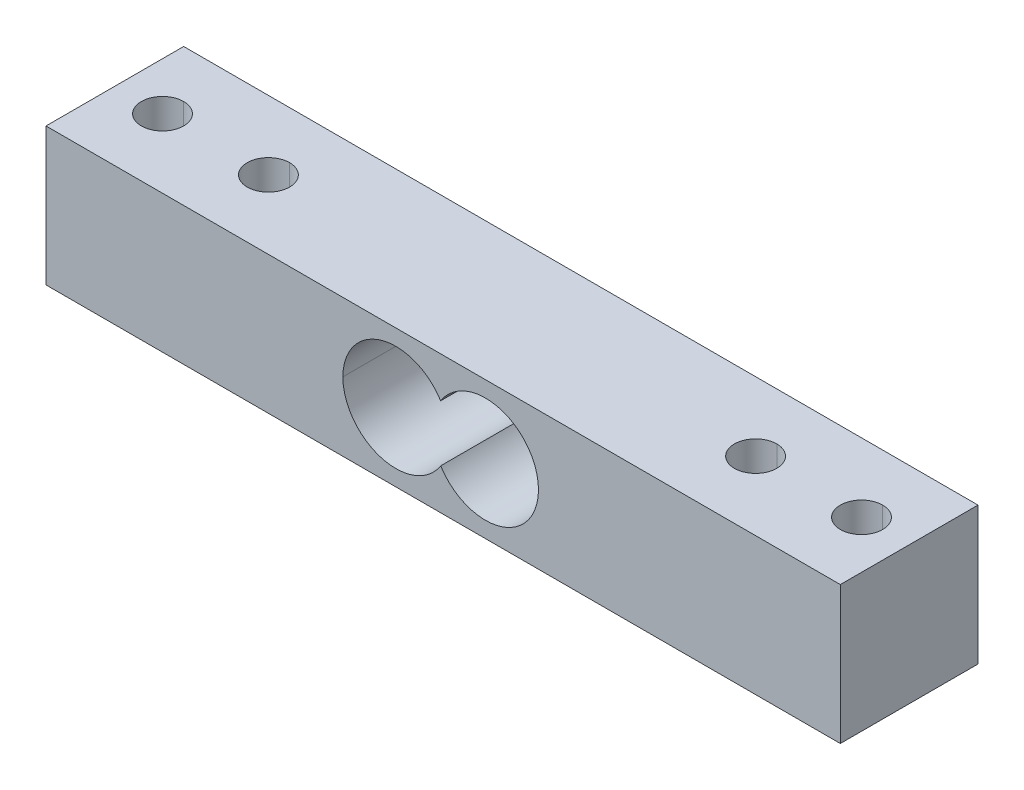
ISO-10303-21;
HEADER;
FILE_DESCRIPTION(('STEP AP214'),'2;1');
FILE_NAME('part.step','',(''),(''),'','','');
FILE_SCHEMA(('AUTOMOTIVE_DESIGN { 1 0 10303 214 1 1 1 1 }'));
ENDSEC;
DATA;
#1=APPLICATION_CONTEXT('core data for automotive mechanical design processes');
#2=APPLICATION_PROTOCOL_DEFINITION('international standard','automotive_design',2000,#1);
#3=PRODUCT_CONTEXT('',#1,'mechanical');
#4=PRODUCT('Part','Part','',(#3));
#5=PRODUCT_RELATED_PRODUCT_CATEGORY('part','',(#4));
#6=PRODUCT_DEFINITION_FORMATION('','',#4);
#7=PRODUCT_DEFINITION_CONTEXT('part definition',#1,'design');
#8=PRODUCT_DEFINITION('design','',#6,#7);
#9=PRODUCT_DEFINITION_SHAPE('','',#8);
#10=(LENGTH_UNIT() NAMED_UNIT(*) SI_UNIT(.MILLI.,.METRE.));
#11=(NAMED_UNIT(*) PLANE_ANGLE_UNIT() SI_UNIT($,.RADIAN.));
#12=(NAMED_UNIT(*) SI_UNIT($,.STERADIAN.) SOLID_ANGLE_UNIT());
#13=UNCERTAINTY_MEASURE_WITH_UNIT(LENGTH_MEASURE(1.E-05),#10,'distance_accuracy_value','');
#14=(GEOMETRIC_REPRESENTATION_CONTEXT(3) GLOBAL_UNCERTAINTY_ASSIGNED_CONTEXT((#13)) GLOBAL_UNIT_ASSIGNED_CONTEXT((#10,
#11,#12)) REPRESENTATION_CONTEXT('',''));
#15=CARTESIAN_POINT('',(0.,0.,0.));
#16=DIRECTION('',(0.,0.,1.));
#17=DIRECTION('',(1.,0.,0.));
#18=AXIS2_PLACEMENT_3D('',#15,#16,#17);
#19=CARTESIAN_POINT('',(33.0303145135468,0.,-6.5));
#20=DIRECTION('',(0.,0.,-1.));
#21=DIRECTION('',(-1.,0.,0.));
#22=AXIS2_PLACEMENT_3D('',#19,#20,#21);
#23=CYLINDRICAL_SURFACE('',#22,5.);
#24=DIRECTION('',(0.,0.,-1.));
#25=VECTOR('',#24,1.);
#26=CARTESIAN_POINT('',(28.0303145135469,0.,-6.5));
#27=LINE('',#26,#25);
#28=CARTESIAN_POINT('',(28.0303145135469,0.,6.5));
#29=VERTEX_POINT('',#28);
#30=CARTESIAN_POINT('',(28.0303145135469,0.,-6.5));
#31=VERTEX_POINT('',#30);
#32=EDGE_CURVE('E206',#29,#31,#27,.T.);
#33=ORIENTED_EDGE('',*,*,#32,.F.);
#34=CARTESIAN_POINT('',(33.0303145135468,0.,6.5));
#35=DIRECTION('',(0.,0.,-1.));
#36=DIRECTION('',(-1.,0.,0.));
#37=AXIS2_PLACEMENT_3D('',#34,#35,#36);
#38=CIRCLE('',#37,5.);
#39=CARTESIAN_POINT('',(37.2651572567734,-2.65821499133177,6.5));
#40=VERTEX_POINT('',#39);
#41=EDGE_CURVE('E307',#40,#29,#38,.T.);
#42=ORIENTED_EDGE('',*,*,#41,.F.);
#43=DIRECTION('',(0.,0.,1.));
#44=VECTOR('',#43,1.);
#45=CARTESIAN_POINT('',(37.2651572567734,-2.65821499133177,0.));
#46=LINE('',#45,#44);
#47=CARTESIAN_POINT('',(37.2651572567734,-2.65821499133177,-6.5));
#48=VERTEX_POINT('',#47);
#49=EDGE_CURVE('E10',#48,#40,#46,.T.);
#50=ORIENTED_EDGE('',*,*,#49,.F.);
#51=CARTESIAN_POINT('',(33.0303145135468,0.,-6.5));
#52=DIRECTION('',(0.,0.,-1.));
#53=DIRECTION('',(-1.,0.,0.));
#54=AXIS2_PLACEMENT_3D('',#51,#52,#53);
#55=CIRCLE('',#54,5.);
#56=EDGE_CURVE('E226',#48,#31,#55,.T.);
#57=ORIENTED_EDGE('',*,*,#56,.T.);
#58=EDGE_LOOP('',(#33,#42,#50,#57));
#59=FACE_BOUND('',#58,.T.);
#60=ADVANCED_FACE('F16',(#59),#23,.F.);
#61=CARTESIAN_POINT('',(41.5,0.,6.5));
#62=DIRECTION('',(0.,0.,1.));
#63=DIRECTION('',(1.,0.,0.));
#64=AXIS2_PLACEMENT_3D('',#61,#62,#63);
#65=CYLINDRICAL_SURFACE('',#64,5.);
#66=DIRECTION('',(0.,0.,1.));
#67=VECTOR('',#66,1.);
#68=CARTESIAN_POINT('',(46.5,0.,6.5));
#69=LINE('',#68,#67);
#70=CARTESIAN_POINT('',(46.5,0.,-6.5));
#71=VERTEX_POINT('',#70);
#72=CARTESIAN_POINT('',(46.5,0.,6.5));
#73=VERTEX_POINT('',#72);
#74=EDGE_CURVE('E239',#71,#73,#69,.T.);
#75=ORIENTED_EDGE('',*,*,#74,.F.);
#76=CARTESIAN_POINT('',(41.5,0.,-6.5));
#77=DIRECTION('',(0.,0.,1.));
#78=DIRECTION('',(1.,0.,0.));
#79=AXIS2_PLACEMENT_3D('',#76,#77,#78);
#80=CIRCLE('',#79,5.);
#81=EDGE_CURVE('E222',#48,#71,#80,.T.);
#82=ORIENTED_EDGE('',*,*,#81,.F.);
#83=ORIENTED_EDGE('',*,*,#49,.T.);
#84=CARTESIAN_POINT('',(41.5,0.,6.5));
#85=DIRECTION('',(0.,0.,1.));
#86=DIRECTION('',(1.,0.,0.));
#87=AXIS2_PLACEMENT_3D('',#84,#85,#86);
#88=CIRCLE('',#87,5.);
#89=EDGE_CURVE('E304',#40,#73,#88,.T.);
#90=ORIENTED_EDGE('',*,*,#89,.T.);
#91=EDGE_LOOP('',(#75,#82,#83,#90));
#92=FACE_BOUND('',#91,.T.);
#93=ADVANCED_FACE('F391',(#92),#65,.F.);
#94=CARTESIAN_POINT('',(70.5,-6.5,0.));
#95=DIRECTION('',(0.,-1.,0.));
#96=DIRECTION('',(0.,0.,-1.));
#97=AXIS2_PLACEMENT_3D('',#94,#95,#96);
#98=CYLINDRICAL_SURFACE('',#97,2.);
#99=DIRECTION('',(0.,-1.,0.));
#100=VECTOR('',#99,1.);
#101=CARTESIAN_POINT('',(70.5,-6.5,2.));
#102=LINE('',#101,#100);
#103=CARTESIAN_POINT('',(70.5,6.5,2.));
#104=VERTEX_POINT('',#103);
#105=CARTESIAN_POINT('',(70.5,-6.5,2.));
#106=VERTEX_POINT('',#105);
#107=EDGE_CURVE('E253',#104,#106,#102,.T.);
#108=ORIENTED_EDGE('',*,*,#107,.F.);
#109=CARTESIAN_POINT('',(70.5,6.5,0.));
#110=DIRECTION('',(0.,-1.,0.));
#111=DIRECTION('',(0.,0.,-1.));
#112=AXIS2_PLACEMENT_3D('',#109,#110,#111);
#113=CIRCLE('',#112,2.);
#114=CARTESIAN_POINT('',(70.5,6.5,-2.));
#115=VERTEX_POINT('',#114);
#116=EDGE_CURVE('E323',#115,#104,#113,.T.);
#117=ORIENTED_EDGE('',*,*,#116,.F.);
#118=DIRECTION('',(0.,-1.,0.));
#119=VECTOR('',#118,1.);
#120=CARTESIAN_POINT('',(70.5,-6.5,-2.));
#121=LINE('',#120,#119);
#122=CARTESIAN_POINT('',(70.5,-6.5,-2.));
#123=VERTEX_POINT('',#122);
#124=EDGE_CURVE('E221',#115,#123,#121,.T.);
#125=ORIENTED_EDGE('',*,*,#124,.T.);
#126=CARTESIAN_POINT('',(70.5,-6.5,0.));
#127=DIRECTION('',(0.,-1.,0.));
#128=DIRECTION('',(0.,0.,-1.));
#129=AXIS2_PLACEMENT_3D('',#126,#127,#128);
#130=CIRCLE('',#129,2.);
#131=EDGE_CURVE('E322',#123,#106,#130,.T.);
#132=ORIENTED_EDGE('',*,*,#131,.T.);
#133=EDGE_LOOP('',(#108,#117,#125,#132));
#134=FACE_BOUND('',#133,.T.);
#135=ADVANCED_FACE('F395',(#134),#98,.F.);
#136=CARTESIAN_POINT('',(60.5,-6.5,0.));
#137=DIRECTION('',(0.,-1.,0.));
#138=DIRECTION('',(0.,0.,-1.));
#139=AXIS2_PLACEMENT_3D('',#136,#137,#138);
#140=CYLINDRICAL_SURFACE('',#139,2.);
#141=DIRECTION('',(0.,-1.,0.));
#142=VECTOR('',#141,1.);
#143=CARTESIAN_POINT('',(60.5,-6.5,2.));
#144=LINE('',#143,#142);
#145=CARTESIAN_POINT('',(60.5,6.5,2.));
#146=VERTEX_POINT('',#145);
#147=CARTESIAN_POINT('',(60.5,-6.5,2.));
#148=VERTEX_POINT('',#147);
#149=EDGE_CURVE('E220',#146,#148,#144,.T.);
#150=ORIENTED_EDGE('',*,*,#149,.F.);
#151=CARTESIAN_POINT('',(60.5,6.5,0.));
#152=DIRECTION('',(0.,-1.,0.));
#153=DIRECTION('',(0.,0.,-1.));
#154=AXIS2_PLACEMENT_3D('',#151,#152,#153);
#155=CIRCLE('',#154,2.);
#156=CARTESIAN_POINT('',(60.5,6.5,-2.));
#157=VERTEX_POINT('',#156);
#158=EDGE_CURVE('E177',#157,#146,#155,.T.);
#159=ORIENTED_EDGE('',*,*,#158,.F.);
#160=DIRECTION('',(0.,-1.,0.));
#161=VECTOR('',#160,1.);
#162=CARTESIAN_POINT('',(60.5,-6.5,-2.));
#163=LINE('',#162,#161);
#164=CARTESIAN_POINT('',(60.5,-6.5,-2.));
#165=VERTEX_POINT('',#164);
#166=EDGE_CURVE('E192',#157,#165,#163,.T.);
#167=ORIENTED_EDGE('',*,*,#166,.T.);
#168=CARTESIAN_POINT('',(60.5,-6.5,0.));
#169=DIRECTION('',(0.,-1.,0.));
#170=DIRECTION('',(0.,0.,-1.));
#171=AXIS2_PLACEMENT_3D('',#168,#169,#170);
#172=CIRCLE('',#171,2.);
#173=EDGE_CURVE('E233',#165,#148,#172,.T.);
#174=ORIENTED_EDGE('',*,*,#173,.T.);
#175=EDGE_LOOP('',(#150,#159,#167,#174));
#176=FACE_BOUND('',#175,.T.);
#177=ADVANCED_FACE('F426',(#176),#140,.F.);
#178=CARTESIAN_POINT('',(14.5,-6.5,0.));
#179=DIRECTION('',(0.,-1.,0.));
#180=DIRECTION('',(0.,0.,-1.));
#181=AXIS2_PLACEMENT_3D('',#178,#179,#180);
#182=CYLINDRICAL_SURFACE('',#181,2.);
#183=DIRECTION('',(0.,-1.,0.));
#184=VECTOR('',#183,1.);
#185=CARTESIAN_POINT('',(14.5,-6.5,2.));
#186=LINE('',#185,#184);
#187=CARTESIAN_POINT('',(14.5,6.5,2.));
#188=VERTEX_POINT('',#187);
#189=CARTESIAN_POINT('',(14.5,-6.5,2.));
#190=VERTEX_POINT('',#189);
#191=EDGE_CURVE('E180',#188,#190,#186,.T.);
#192=ORIENTED_EDGE('',*,*,#191,.F.);
#193=CARTESIAN_POINT('',(14.5,6.5,0.));
#194=DIRECTION('',(0.,-1.,0.));
#195=DIRECTION('',(0.,0.,-1.));
#196=AXIS2_PLACEMENT_3D('',#193,#194,#195);
#197=CIRCLE('',#196,2.);
#198=CARTESIAN_POINT('',(14.5,6.5,-2.));
#199=VERTEX_POINT('',#198);
#200=EDGE_CURVE('E167',#199,#188,#197,.T.);
#201=ORIENTED_EDGE('',*,*,#200,.F.);
#202=DIRECTION('',(0.,-1.,0.));
#203=VECTOR('',#202,1.);
#204=CARTESIAN_POINT('',(14.5,-6.5,-2.));
#205=LINE('',#204,#203);
#206=CARTESIAN_POINT('',(14.5,-6.5,-2.));
#207=VERTEX_POINT('',#206);
#208=EDGE_CURVE('E190',#199,#207,#205,.T.);
#209=ORIENTED_EDGE('',*,*,#208,.T.);
#210=CARTESIAN_POINT('',(14.5,-6.5,0.));
#211=DIRECTION('',(0.,-1.,0.));
#212=DIRECTION('',(0.,0.,-1.));
#213=AXIS2_PLACEMENT_3D('',#210,#211,#212);
#214=CIRCLE('',#213,2.);
#215=EDGE_CURVE('E182',#207,#190,#214,.T.);
#216=ORIENTED_EDGE('',*,*,#215,.T.);
#217=EDGE_LOOP('',(#192,#201,#209,#216));
#218=FACE_BOUND('',#217,.T.);
#219=ADVANCED_FACE('F181',(#218),#182,.F.);
#220=CARTESIAN_POINT('',(4.5,-6.5,0.));
#221=DIRECTION('',(0.,-1.,0.));
#222=DIRECTION('',(0.,0.,-1.));
#223=AXIS2_PLACEMENT_3D('',#220,#221,#222);
#224=CYLINDRICAL_SURFACE('',#223,2.);
#225=DIRECTION('',(0.,-1.,0.));
#226=VECTOR('',#225,1.);
#227=CARTESIAN_POINT('',(4.5,-6.5,2.));
#228=LINE('',#227,#226);
#229=CARTESIAN_POINT('',(4.5,6.5,2.));
#230=VERTEX_POINT('',#229);
#231=CARTESIAN_POINT('',(4.5,-6.5,2.));
#232=VERTEX_POINT('',#231);
#233=EDGE_CURVE('E271',#230,#232,#228,.T.);
#234=ORIENTED_EDGE('',*,*,#233,.F.);
#235=CARTESIAN_POINT('',(4.5,6.5,0.));
#236=DIRECTION('',(0.,-1.,0.));
#237=DIRECTION('',(0.,0.,-1.));
#238=AXIS2_PLACEMENT_3D('',#235,#236,#237);
#239=CIRCLE('',#238,2.);
#240=CARTESIAN_POINT('',(4.5,6.5,-2.));
#241=VERTEX_POINT('',#240);
#242=EDGE_CURVE('E24',#241,#230,#239,.T.);
#243=ORIENTED_EDGE('',*,*,#242,.F.);
#244=DIRECTION('',(0.,-1.,0.));
#245=VECTOR('',#244,1.);
#246=CARTESIAN_POINT('',(4.5,-6.5,-2.));
#247=LINE('',#246,#245);
#248=CARTESIAN_POINT('',(4.5,-6.5,-2.));
#249=VERTEX_POINT('',#248);
#250=EDGE_CURVE('E282',#241,#249,#247,.T.);
#251=ORIENTED_EDGE('',*,*,#250,.T.);
#252=CARTESIAN_POINT('',(4.5,-6.5,0.));
#253=DIRECTION('',(0.,-1.,0.));
#254=DIRECTION('',(0.,0.,-1.));
#255=AXIS2_PLACEMENT_3D('',#252,#253,#254);
#256=CIRCLE('',#255,2.);
#257=EDGE_CURVE('E232',#249,#232,#256,.T.);
#258=ORIENTED_EDGE('',*,*,#257,.T.);
#259=EDGE_LOOP('',(#234,#243,#251,#258));
#260=FACE_BOUND('',#259,.T.);
#261=ADVANCED_FACE('F352',(#260),#224,.F.);
#262=CARTESIAN_POINT('',(0.,6.5,0.));
#263=DIRECTION('',(0.,1.,0.));
#264=DIRECTION('',(1.,0.,0.));
#265=AXIS2_PLACEMENT_3D('',#262,#263,#264);
#266=PLANE('',#265);
#267=ORIENTED_EDGE('',*,*,#242,.T.);
#268=CARTESIAN_POINT('',(4.5,6.5,0.));
#269=DIRECTION('',(0.,-1.,0.));
#270=DIRECTION('',(0.,0.,-1.));
#271=AXIS2_PLACEMENT_3D('',#268,#269,#270);
#272=CIRCLE('',#271,2.);
#273=EDGE_CURVE('E270',#230,#241,#272,.T.);
#274=ORIENTED_EDGE('',*,*,#273,.T.);
#275=EDGE_LOOP('',(#267,#274));
#276=FACE_BOUND('',#275,.T.);
#277=ORIENTED_EDGE('',*,*,#200,.T.);
#278=CARTESIAN_POINT('',(14.5,6.5,0.));
#279=DIRECTION('',(0.,-1.,0.));
#280=DIRECTION('',(0.,0.,-1.));
#281=AXIS2_PLACEMENT_3D('',#278,#279,#280);
#282=CIRCLE('',#281,2.);
#283=EDGE_CURVE('E172',#188,#199,#282,.T.);
#284=ORIENTED_EDGE('',*,*,#283,.T.);
#285=EDGE_LOOP('',(#277,#284));
#286=FACE_BOUND('',#285,.T.);
#287=ORIENTED_EDGE('',*,*,#158,.T.);
#288=CARTESIAN_POINT('',(60.5,6.5,0.));
#289=DIRECTION('',(0.,-1.,0.));
#290=DIRECTION('',(0.,0.,-1.));
#291=AXIS2_PLACEMENT_3D('',#288,#289,#290);
#292=CIRCLE('',#291,2.);
#293=EDGE_CURVE('E216',#146,#157,#292,.T.);
#294=ORIENTED_EDGE('',*,*,#293,.T.);
#295=EDGE_LOOP('',(#287,#294));
#296=FACE_BOUND('',#295,.T.);
#297=ORIENTED_EDGE('',*,*,#116,.T.);
#298=CARTESIAN_POINT('',(70.5,6.5,0.));
#299=DIRECTION('',(0.,-1.,0.));
#300=DIRECTION('',(0.,0.,-1.));
#301=AXIS2_PLACEMENT_3D('',#298,#299,#300);
#302=CIRCLE('',#301,2.);
#303=EDGE_CURVE('E250',#104,#115,#302,.T.);
#304=ORIENTED_EDGE('',*,*,#303,.T.);
#305=EDGE_LOOP('',(#297,#304));
#306=FACE_BOUND('',#305,.T.);
#307=DIRECTION('',(-1.,0.,0.));
#308=VECTOR('',#307,1.);
#309=CARTESIAN_POINT('',(75.,6.5,-6.5));
#310=LINE('',#309,#308);
#311=CARTESIAN_POINT('',(75.,6.5,-6.5));
#312=VERTEX_POINT('',#311);
#313=CARTESIAN_POINT('',(0.,6.5,-6.5));
#314=VERTEX_POINT('',#313);
#315=EDGE_CURVE('E328',#312,#314,#310,.T.);
#316=ORIENTED_EDGE('',*,*,#315,.T.);
#317=DIRECTION('',(0.,0.,1.));
#318=VECTOR('',#317,1.);
#319=CARTESIAN_POINT('',(0.,6.5,-6.5));
#320=LINE('',#319,#318);
#321=CARTESIAN_POINT('',(0.,6.5,6.5));
#322=VERTEX_POINT('',#321);
#323=EDGE_CURVE('E46',#314,#322,#320,.T.);
#324=ORIENTED_EDGE('',*,*,#323,.T.);
#325=DIRECTION('',(1.,0.,0.));
#326=VECTOR('',#325,1.);
#327=CARTESIAN_POINT('',(0.,6.5,6.5));
#328=LINE('',#327,#326);
#329=CARTESIAN_POINT('',(75.,6.5,6.5));
#330=VERTEX_POINT('',#329);
#331=EDGE_CURVE('E286',#322,#330,#328,.T.);
#332=ORIENTED_EDGE('',*,*,#331,.T.);
#333=DIRECTION('',(0.,0.,-1.));
#334=VECTOR('',#333,1.);
#335=CARTESIAN_POINT('',(75.,6.5,6.5));
#336=LINE('',#335,#334);
#337=EDGE_CURVE('E225',#330,#312,#336,.T.);
#338=ORIENTED_EDGE('',*,*,#337,.T.);
#339=EDGE_LOOP('',(#316,#324,#332,#338));
#340=FACE_BOUND('',#339,.T.);
#341=ADVANCED_FACE('F169',(#276,#286,#296,#306,#340),#266,.T.);
#342=CARTESIAN_POINT('',(0.,-6.5,-6.5));
#343=DIRECTION('',(-1.,0.,0.));
#344=DIRECTION('',(0.,0.,1.));
#345=AXIS2_PLACEMENT_3D('',#342,#343,#344);
#346=PLANE('',#345);
#347=ORIENTED_EDGE('',*,*,#323,.F.);
#348=DIRECTION('',(0.,1.,0.));
#349=VECTOR('',#348,1.);
#350=CARTESIAN_POINT('',(0.,-6.5,-6.5));
#351=LINE('',#350,#349);
#352=CARTESIAN_POINT('',(0.,-6.5,-6.5));
#353=VERTEX_POINT('',#352);
#354=EDGE_CURVE('E336',#353,#314,#351,.T.);
#355=ORIENTED_EDGE('',*,*,#354,.F.);
#356=DIRECTION('',(0.,0.,1.));
#357=VECTOR('',#356,1.);
#358=CARTESIAN_POINT('',(0.,-6.5,-6.5));
#359=LINE('',#358,#357);
#360=CARTESIAN_POINT('',(0.,-6.5,6.5));
#361=VERTEX_POINT('',#360);
#362=EDGE_CURVE('E293',#353,#361,#359,.T.);
#363=ORIENTED_EDGE('',*,*,#362,.T.);
#364=DIRECTION('',(0.,1.,0.));
#365=VECTOR('',#364,1.);
#366=CARTESIAN_POINT('',(0.,-6.5,6.5));
#367=LINE('',#366,#365);
#368=EDGE_CURVE('E290',#361,#322,#367,.T.);
#369=ORIENTED_EDGE('',*,*,#368,.T.);
#370=EDGE_LOOP('',(#347,#355,#363,#369));
#371=FACE_BOUND('',#370,.T.);
#372=ADVANCED_FACE('F378',(#371),#346,.T.);
#373=CARTESIAN_POINT('',(75.,-6.5,6.5));
#374=DIRECTION('',(1.,0.,0.));
#375=DIRECTION('',(0.,1.,0.));
#376=AXIS2_PLACEMENT_3D('',#373,#374,#375);
#377=PLANE('',#376);
#378=ORIENTED_EDGE('',*,*,#337,.F.);
#379=DIRECTION('',(0.,1.,0.));
#380=VECTOR('',#379,1.);
#381=CARTESIAN_POINT('',(75.,-6.5,6.5));
#382=LINE('',#381,#380);
#383=CARTESIAN_POINT('',(75.,-6.5,6.5));
#384=VERTEX_POINT('',#383);
#385=EDGE_CURVE('E300',#384,#330,#382,.T.);
#386=ORIENTED_EDGE('',*,*,#385,.F.);
#387=DIRECTION('',(0.,0.,-1.));
#388=VECTOR('',#387,1.);
#389=CARTESIAN_POINT('',(75.,-6.5,6.5));
#390=LINE('',#389,#388);
#391=CARTESIAN_POINT('',(75.,-6.5,-6.5));
#392=VERTEX_POINT('',#391);
#393=EDGE_CURVE('E314',#384,#392,#390,.T.);
#394=ORIENTED_EDGE('',*,*,#393,.T.);
#395=DIRECTION('',(0.,1.,0.));
#396=VECTOR('',#395,1.);
#397=CARTESIAN_POINT('',(75.,-6.5,-6.5));
#398=LINE('',#397,#396);
#399=EDGE_CURVE('E332',#392,#312,#398,.T.);
#400=ORIENTED_EDGE('',*,*,#399,.T.);
#401=EDGE_LOOP('',(#378,#386,#394,#400));
#402=FACE_BOUND('',#401,.T.);
#403=ADVANCED_FACE('F374',(#402),#377,.T.);
#404=CARTESIAN_POINT('',(75.,-6.5,-6.5));
#405=DIRECTION('',(0.,0.,-1.));
#406=DIRECTION('',(0.,-1.,0.));
#407=AXIS2_PLACEMENT_3D('',#404,#405,#406);
#408=PLANE('',#407);
#409=ORIENTED_EDGE('',*,*,#56,.F.);
#410=ORIENTED_EDGE('',*,*,#81,.T.);
#411=CARTESIAN_POINT('',(41.5,0.,-6.5));
#412=DIRECTION('',(0.,0.,1.));
#413=DIRECTION('',(1.,0.,0.));
#414=AXIS2_PLACEMENT_3D('',#411,#412,#413);
#415=CIRCLE('',#414,5.);
#416=CARTESIAN_POINT('',(37.2651572567734,2.65821499133177,-6.5));
#417=VERTEX_POINT('',#416);
#418=EDGE_CURVE('E211',#71,#417,#415,.T.);
#419=ORIENTED_EDGE('',*,*,#418,.T.);
#420=CARTESIAN_POINT('',(33.0303145135468,0.,-6.5));
#421=DIRECTION('',(0.,0.,-1.));
#422=DIRECTION('',(-1.,0.,0.));
#423=AXIS2_PLACEMENT_3D('',#420,#421,#422);
#424=CIRCLE('',#423,5.);
#425=EDGE_CURVE('E212',#31,#417,#424,.T.);
#426=ORIENTED_EDGE('',*,*,#425,.F.);
#427=EDGE_LOOP('',(#409,#410,#419,#426));
#428=FACE_BOUND('',#427,.T.);
#429=ORIENTED_EDGE('',*,*,#315,.F.);
#430=ORIENTED_EDGE('',*,*,#399,.F.);
#431=DIRECTION('',(-1.,0.,0.));
#432=VECTOR('',#431,1.);
#433=CARTESIAN_POINT('',(75.,-6.5,-6.5));
#434=LINE('',#433,#432);
#435=EDGE_CURVE('E310',#392,#353,#434,.T.);
#436=ORIENTED_EDGE('',*,*,#435,.T.);
#437=ORIENTED_EDGE('',*,*,#354,.T.);
#438=EDGE_LOOP('',(#429,#430,#436,#437));
#439=FACE_BOUND('',#438,.T.);
#440=ADVANCED_FACE('F361',(#428,#439),#408,.T.);
#441=CARTESIAN_POINT('',(0.,-6.5,0.));
#442=DIRECTION('',(0.,1.,0.));
#443=DIRECTION('',(1.,0.,0.));
#444=AXIS2_PLACEMENT_3D('',#441,#442,#443);
#445=PLANE('',#444);
#446=ORIENTED_EDGE('',*,*,#131,.F.);
#447=CARTESIAN_POINT('',(70.5,-6.5,0.));
#448=DIRECTION('',(0.,-1.,0.));
#449=DIRECTION('',(0.,0.,-1.));
#450=AXIS2_PLACEMENT_3D('',#447,#448,#449);
#451=CIRCLE('',#450,2.);
#452=EDGE_CURVE('E243',#106,#123,#451,.T.);
#453=ORIENTED_EDGE('',*,*,#452,.F.);
#454=EDGE_LOOP('',(#446,#453));
#455=FACE_BOUND('',#454,.T.);
#456=ORIENTED_EDGE('',*,*,#257,.F.);
#457=CARTESIAN_POINT('',(4.5,-6.5,0.));
#458=DIRECTION('',(0.,-1.,0.));
#459=DIRECTION('',(0.,0.,-1.));
#460=AXIS2_PLACEMENT_3D('',#457,#458,#459);
#461=CIRCLE('',#460,2.);
#462=EDGE_CURVE('E275',#232,#249,#461,.T.);
#463=ORIENTED_EDGE('',*,*,#462,.F.);
#464=EDGE_LOOP('',(#456,#463));
#465=FACE_BOUND('',#464,.T.);
#466=ORIENTED_EDGE('',*,*,#215,.F.);
#467=CARTESIAN_POINT('',(14.5,-6.5,0.));
#468=DIRECTION('',(0.,-1.,0.));
#469=DIRECTION('',(0.,0.,-1.));
#470=AXIS2_PLACEMENT_3D('',#467,#468,#469);
#471=CIRCLE('',#470,2.);
#472=EDGE_CURVE('E187',#190,#207,#471,.T.);
#473=ORIENTED_EDGE('',*,*,#472,.F.);
#474=EDGE_LOOP('',(#466,#473));
#475=FACE_BOUND('',#474,.T.);
#476=ORIENTED_EDGE('',*,*,#173,.F.);
#477=CARTESIAN_POINT('',(60.5,-6.5,0.));
#478=DIRECTION('',(0.,-1.,0.));
#479=DIRECTION('',(0.,0.,-1.));
#480=AXIS2_PLACEMENT_3D('',#477,#478,#479);
#481=CIRCLE('',#480,2.);
#482=EDGE_CURVE('E199',#148,#165,#481,.T.);
#483=ORIENTED_EDGE('',*,*,#482,.F.);
#484=EDGE_LOOP('',(#476,#483));
#485=FACE_BOUND('',#484,.T.);
#486=ORIENTED_EDGE('',*,*,#435,.F.);
#487=ORIENTED_EDGE('',*,*,#393,.F.);
#488=DIRECTION('',(1.,0.,0.));
#489=VECTOR('',#488,1.);
#490=CARTESIAN_POINT('',(0.,-6.5,6.5));
#491=LINE('',#490,#489);
#492=EDGE_CURVE('E296',#361,#384,#491,.T.);
#493=ORIENTED_EDGE('',*,*,#492,.F.);
#494=ORIENTED_EDGE('',*,*,#362,.F.);
#495=EDGE_LOOP('',(#486,#487,#493,#494));
#496=FACE_BOUND('',#495,.T.);
#497=ADVANCED_FACE('F357',(#455,#465,#475,#485,#496),#445,.F.);
#498=CARTESIAN_POINT('',(0.,-6.5,6.5));
#499=DIRECTION('',(0.,0.,1.));
#500=DIRECTION('',(1.,0.,0.));
#501=AXIS2_PLACEMENT_3D('',#498,#499,#500);
#502=PLANE('',#501);
#503=ORIENTED_EDGE('',*,*,#89,.F.);
#504=ORIENTED_EDGE('',*,*,#41,.T.);
#505=CARTESIAN_POINT('',(33.0303145135468,0.,6.5));
#506=DIRECTION('',(0.,0.,-1.));
#507=DIRECTION('',(-1.,0.,0.));
#508=AXIS2_PLACEMENT_3D('',#505,#506,#507);
#509=CIRCLE('',#508,5.);
#510=CARTESIAN_POINT('',(37.2651572567734,2.65821499133177,6.5));
#511=VERTEX_POINT('',#510);
#512=EDGE_CURVE('E202',#29,#511,#509,.T.);
#513=ORIENTED_EDGE('',*,*,#512,.T.);
#514=CARTESIAN_POINT('',(41.5,0.,6.5));
#515=DIRECTION('',(0.,0.,1.));
#516=DIRECTION('',(1.,0.,0.));
#517=AXIS2_PLACEMENT_3D('',#514,#515,#516);
#518=CIRCLE('',#517,5.);
#519=EDGE_CURVE('E246',#73,#511,#518,.T.);
#520=ORIENTED_EDGE('',*,*,#519,.F.);
#521=EDGE_LOOP('',(#503,#504,#513,#520));
#522=FACE_BOUND('',#521,.T.);
#523=ORIENTED_EDGE('',*,*,#331,.F.);
#524=ORIENTED_EDGE('',*,*,#368,.F.);
#525=ORIENTED_EDGE('',*,*,#492,.T.);
#526=ORIENTED_EDGE('',*,*,#385,.T.);
#527=EDGE_LOOP('',(#523,#524,#525,#526));
#528=FACE_BOUND('',#527,.T.);
#529=ADVANCED_FACE('F360',(#522,#528),#502,.T.);
#530=CARTESIAN_POINT('',(4.5,-6.5,0.));
#531=DIRECTION('',(0.,-1.,0.));
#532=DIRECTION('',(0.,0.,-1.));
#533=AXIS2_PLACEMENT_3D('',#530,#531,#532);
#534=CYLINDRICAL_SURFACE('',#533,2.);
#535=ORIENTED_EDGE('',*,*,#273,.F.);
#536=ORIENTED_EDGE('',*,*,#233,.T.);
#537=ORIENTED_EDGE('',*,*,#462,.T.);
#538=ORIENTED_EDGE('',*,*,#250,.F.);
#539=EDGE_LOOP('',(#535,#536,#537,#538));
#540=FACE_BOUND('',#539,.T.);
#541=ADVANCED_FACE('F355',(#540),#534,.F.);
#542=CARTESIAN_POINT('',(14.5,-6.5,0.));
#543=DIRECTION('',(0.,-1.,0.));
#544=DIRECTION('',(0.,0.,-1.));
#545=AXIS2_PLACEMENT_3D('',#542,#543,#544);
#546=CYLINDRICAL_SURFACE('',#545,2.);
#547=ORIENTED_EDGE('',*,*,#283,.F.);
#548=ORIENTED_EDGE('',*,*,#191,.T.);
#549=ORIENTED_EDGE('',*,*,#472,.T.);
#550=ORIENTED_EDGE('',*,*,#208,.F.);
#551=EDGE_LOOP('',(#547,#548,#549,#550));
#552=FACE_BOUND('',#551,.T.);
#553=ADVANCED_FACE('F189',(#552),#546,.F.);
#554=CARTESIAN_POINT('',(60.5,-6.5,0.));
#555=DIRECTION('',(0.,-1.,0.));
#556=DIRECTION('',(0.,0.,-1.));
#557=AXIS2_PLACEMENT_3D('',#554,#555,#556);
#558=CYLINDRICAL_SURFACE('',#557,2.);
#559=ORIENTED_EDGE('',*,*,#293,.F.);
#560=ORIENTED_EDGE('',*,*,#149,.T.);
#561=ORIENTED_EDGE('',*,*,#482,.T.);
#562=ORIENTED_EDGE('',*,*,#166,.F.);
#563=EDGE_LOOP('',(#559,#560,#561,#562));
#564=FACE_BOUND('',#563,.T.);
#565=ADVANCED_FACE('F420',(#564),#558,.F.);
#566=CARTESIAN_POINT('',(70.5,-6.5,0.));
#567=DIRECTION('',(0.,-1.,0.));
#568=DIRECTION('',(0.,0.,-1.));
#569=AXIS2_PLACEMENT_3D('',#566,#567,#568);
#570=CYLINDRICAL_SURFACE('',#569,2.);
#571=ORIENTED_EDGE('',*,*,#303,.F.);
#572=ORIENTED_EDGE('',*,*,#107,.T.);
#573=ORIENTED_EDGE('',*,*,#452,.T.);
#574=ORIENTED_EDGE('',*,*,#124,.F.);
#575=EDGE_LOOP('',(#571,#572,#573,#574));
#576=FACE_BOUND('',#575,.T.);
#577=ADVANCED_FACE('F413',(#576),#570,.F.);
#578=CARTESIAN_POINT('',(41.5,0.,6.5));
#579=DIRECTION('',(0.,0.,1.));
#580=DIRECTION('',(1.,0.,0.));
#581=AXIS2_PLACEMENT_3D('',#578,#579,#580);
#582=CYLINDRICAL_SURFACE('',#581,5.);
#583=ORIENTED_EDGE('',*,*,#418,.F.);
#584=ORIENTED_EDGE('',*,*,#74,.T.);
#585=ORIENTED_EDGE('',*,*,#519,.T.);
#586=DIRECTION('',(0.,0.,-1.));
#587=VECTOR('',#586,1.);
#588=CARTESIAN_POINT('',(37.2651572567734,2.65821499133177,0.));
#589=LINE('',#588,#587);
#590=EDGE_CURVE('E207',#511,#417,#589,.T.);
#591=ORIENTED_EDGE('',*,*,#590,.T.);
#592=EDGE_LOOP('',(#583,#584,#585,#591));
#593=FACE_BOUND('',#592,.T.);
#594=ADVANCED_FACE('F411',(#593),#582,.F.);
#595=CARTESIAN_POINT('',(33.0303145135468,0.,-6.5));
#596=DIRECTION('',(0.,0.,-1.));
#597=DIRECTION('',(-1.,0.,0.));
#598=AXIS2_PLACEMENT_3D('',#595,#596,#597);
#599=CYLINDRICAL_SURFACE('',#598,5.);
#600=ORIENTED_EDGE('',*,*,#512,.F.);
#601=ORIENTED_EDGE('',*,*,#32,.T.);
#602=ORIENTED_EDGE('',*,*,#425,.T.);
#603=ORIENTED_EDGE('',*,*,#590,.F.);
#604=EDGE_LOOP('',(#600,#601,#602,#603));
#605=FACE_BOUND('',#604,.T.);
#606=ADVANCED_FACE('F404',(#605),#599,.F.);
#607=CLOSED_SHELL('',(#60,#93,#135,#177,#219,#261,#341,#372,#403,#440,#497,#529,#541,#553,#565,
#577,#594,#606));
#608=MANIFOLD_SOLID_BREP('B1',#607);
#609=ADVANCED_BREP_SHAPE_REPRESENTATION('',(#18,#608),#14);
#610=SHAPE_DEFINITION_REPRESENTATION(#9,#609);
ENDSEC;
END-ISO-10303-21;
